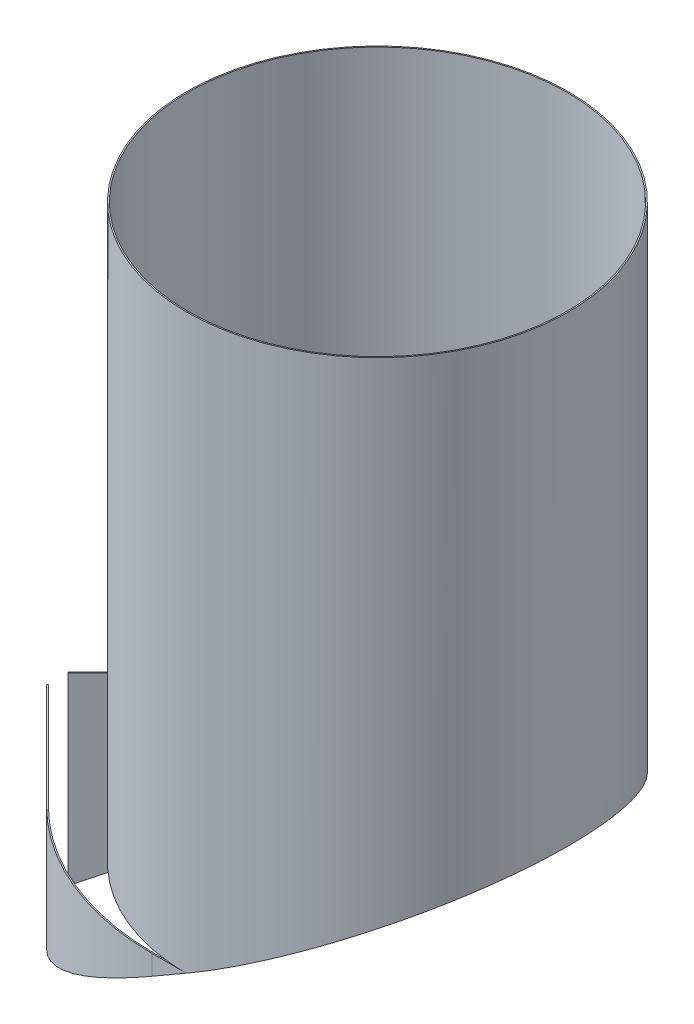
ISO-10303-21;
HEADER;
FILE_DESCRIPTION(('STEP AP214'),'2;1');
FILE_NAME('part.step','',(''),(''),'','','');
FILE_SCHEMA(('AUTOMOTIVE_DESIGN { 1 0 10303 214 1 1 1 1 }'));
ENDSEC;
DATA;
#1=APPLICATION_CONTEXT('core data for automotive mechanical design processes');
#2=APPLICATION_PROTOCOL_DEFINITION('international standard','automotive_design',2000,#1);
#3=PRODUCT_CONTEXT('',#1,'mechanical');
#4=PRODUCT('Part','Part','',(#3));
#5=PRODUCT_RELATED_PRODUCT_CATEGORY('part','',(#4));
#6=PRODUCT_DEFINITION_FORMATION('','',#4);
#7=PRODUCT_DEFINITION_CONTEXT('part definition',#1,'design');
#8=PRODUCT_DEFINITION('design','',#6,#7);
#9=PRODUCT_DEFINITION_SHAPE('','',#8);
#10=(LENGTH_UNIT() NAMED_UNIT(*) SI_UNIT(.MILLI.,.METRE.));
#11=(NAMED_UNIT(*) PLANE_ANGLE_UNIT() SI_UNIT($,.RADIAN.));
#12=(NAMED_UNIT(*) SI_UNIT($,.STERADIAN.) SOLID_ANGLE_UNIT());
#13=UNCERTAINTY_MEASURE_WITH_UNIT(LENGTH_MEASURE(1.E-05),#10,'distance_accuracy_value','');
#14=(GEOMETRIC_REPRESENTATION_CONTEXT(3) GLOBAL_UNCERTAINTY_ASSIGNED_CONTEXT((#13)) GLOBAL_UNIT_ASSIGNED_CONTEXT((#10,
#11,#12)) REPRESENTATION_CONTEXT('',''));
#15=CARTESIAN_POINT('',(0.,0.,0.));
#16=DIRECTION('',(0.,0.,1.));
#17=DIRECTION('',(1.,0.,0.));
#18=AXIS2_PLACEMENT_3D('',#15,#16,#17);
#19=CARTESIAN_POINT('',(0.,600.,0.));
#20=DIRECTION('',(0.,-1.,0.));
#21=DIRECTION('',(0.,0.,-1.));
#22=AXIS2_PLACEMENT_3D('',#19,#20,#21);
#23=CYLINDRICAL_SURFACE('',#22,12.);
#24=DIRECTION('',(0.,-1.,0.));
#25=VECTOR('',#24,1.);
#26=CARTESIAN_POINT('',(9.16287404383041,600.,-7.74866048145735));
#27=LINE('',#26,#25);
#28=CARTESIAN_POINT('',(9.16287404383041,150.,-7.74866048145735));
#29=VERTEX_POINT('',#28);
#30=CARTESIAN_POINT('',(9.16287404383041,5.29018779575605,-7.74866048145735));
#31=VERTEX_POINT('',#30);
#32=EDGE_CURVE('E163',#29,#31,#27,.T.);
#33=ORIENTED_EDGE('',*,*,#32,.F.);
#34=CARTESIAN_POINT('',(0.,150.,0.));
#35=DIRECTION('',(0.,1.,0.));
#36=DIRECTION('',(0.,0.,1.));
#37=AXIS2_PLACEMENT_3D('',#34,#35,#36);
#38=CIRCLE('',#37,12.);
#39=CARTESIAN_POINT('',(8.48528137423856,150.,-8.48528137423859));
#40=VERTEX_POINT('',#39);
#41=EDGE_CURVE('E195',#40,#29,#38,.F.);
#42=ORIENTED_EDGE('',*,*,#41,.F.);
#43=DIRECTION('',(0.,-1.,0.));
#44=VECTOR('',#43,1.);
#45=CARTESIAN_POINT('',(8.48528137423855,600.,-8.48528137423859));
#46=LINE('',#45,#44);
#47=CARTESIAN_POINT('',(8.48528137423856,4.89897948556643,-8.48528137423858));
#48=VERTEX_POINT('',#47);
#49=EDGE_CURVE('E185',#40,#48,#46,.T.);
#50=ORIENTED_EDGE('',*,*,#49,.T.);
#51=CARTESIAN_POINT('',(0.,0.,0.));
#52=DIRECTION('',(-0.499999999999995,0.866025403784442,0.));
#53=DIRECTION('',(-0.866025403784442,-0.499999999999995,0.));
#54=AXIS2_PLACEMENT_3D('',#51,#52,#53);
#55=ELLIPSE('',#54,13.856406460551,12.);
#56=EDGE_CURVE('E169',#48,#31,#55,.F.);
#57=ORIENTED_EDGE('',*,*,#56,.T.);
#58=EDGE_LOOP('',(#33,#42,#50,#57));
#59=FACE_BOUND('',#58,.T.);
#60=ADVANCED_FACE('F35',(#59),#23,.F.);
#61=CARTESIAN_POINT('',(260.,150.,0.));
#62=DIRECTION('',(0.,1.,0.));
#63=DIRECTION('',(0.,0.,1.));
#64=AXIS2_PLACEMENT_3D('',#61,#62,#63);
#65=PLANE('',#64);
#66=DIRECTION('',(0.707106781186546,0.,0.707106781186549));
#67=VECTOR('',#66,1.);
#68=CARTESIAN_POINT('',(9.1923881554251,150.,7.77817459305204));
#69=LINE('',#68,#67);
#70=CARTESIAN_POINT('',(9.16287404383041,150.,7.74866048145735));
#71=VERTEX_POINT('',#70);
#72=CARTESIAN_POINT('',(92.1284630184955,150.,90.7142494561227));
#73=VERTEX_POINT('',#72);
#74=EDGE_CURVE('E268',#71,#73,#69,.T.);
#75=ORIENTED_EDGE('',*,*,#74,.F.);
#76=CARTESIAN_POINT('',(8.48528137423856,150.,8.48528137423859));
#77=VERTEX_POINT('',#76);
#78=EDGE_CURVE('E161',#71,#77,#38,.F.);
#79=ORIENTED_EDGE('',*,*,#78,.T.);
#80=DIRECTION('',(0.707106781186546,0.,0.707106781186549));
#81=VECTOR('',#80,1.);
#82=CARTESIAN_POINT('',(0.,150.,0.));
#83=LINE('',#82,#81);
#84=CARTESIAN_POINT('',(91.4213562373089,150.,91.4213562373092));
#85=VERTEX_POINT('',#84);
#86=EDGE_CURVE('E223',#77,#85,#83,.T.);
#87=ORIENTED_EDGE('',*,*,#86,.T.);
#88=CARTESIAN_POINT('',(232.842712474619,150.,-50.));
#89=DIRECTION('',(0.,1.,0.));
#90=DIRECTION('',(0.,0.,1.));
#91=AXIS2_PLACEMENT_3D('',#88,#89,#90);
#92=CIRCLE('',#91,200.);
#93=CARTESIAN_POINT('',(232.842712474619,150.,150.));
#94=VERTEX_POINT('',#93);
#95=EDGE_CURVE('E241',#85,#94,#92,.T.);
#96=ORIENTED_EDGE('',*,*,#95,.T.);
#97=DIRECTION('',(1.,0.,0.));
#98=VECTOR('',#97,1.);
#99=CARTESIAN_POINT('',(149.999999999999,150.,150.));
#100=LINE('',#99,#98);
#101=CARTESIAN_POINT('',(259.807621135335,150.,149.999938317262));
#102=VERTEX_POINT('',#101);
#103=EDGE_CURVE('E219',#94,#102,#100,.T.);
#104=ORIENTED_EDGE('',*,*,#103,.T.);
#105=CARTESIAN_POINT('',(260.,150.,0.));
#106=DIRECTION('',(0.,-1.,0.));
#107=DIRECTION('',(0.,0.,1.));
#108=AXIS2_PLACEMENT_3D('',#105,#106,#107);
#109=CIRCLE('',#108,150.);
#110=CARTESIAN_POINT('',(242.708383534209,150.,149.));
#111=VERTEX_POINT('',#110);
#112=EDGE_CURVE('E199',#102,#111,#109,.T.);
#113=ORIENTED_EDGE('',*,*,#112,.T.);
#114=DIRECTION('',(1.,0.,0.));
#115=VECTOR('',#114,1.);
#116=CARTESIAN_POINT('',(149.999999999999,150.,149.));
#117=LINE('',#116,#115);
#118=CARTESIAN_POINT('',(232.842712474619,150.,149.));
#119=VERTEX_POINT('',#118);
#120=EDGE_CURVE('E285',#119,#111,#117,.T.);
#121=ORIENTED_EDGE('',*,*,#120,.F.);
#122=CARTESIAN_POINT('',(232.842712474619,150.,-50.));
#123=DIRECTION('',(0.,1.,0.));
#124=DIRECTION('',(0.,0.,1.));
#125=AXIS2_PLACEMENT_3D('',#122,#123,#124);
#126=CIRCLE('',#125,199.);
#127=EDGE_CURVE('E286',#73,#119,#126,.T.);
#128=ORIENTED_EDGE('',*,*,#127,.F.);
#129=EDGE_LOOP('',(#75,#79,#87,#96,#104,#113,#121,#128));
#130=FACE_BOUND('',#129,.T.);
#131=ADVANCED_FACE('F265',(#130),#65,.T.);
#132=ORIENTED_EDGE('',*,*,#78,.F.);
#133=DIRECTION('',(0.,-1.,0.));
#134=VECTOR('',#133,1.);
#135=CARTESIAN_POINT('',(9.16287404383041,600.,7.74866048145735));
#136=LINE('',#135,#134);
#137=CARTESIAN_POINT('',(9.16287404383041,5.29018779575605,7.74866048145735));
#138=VERTEX_POINT('',#137);
#139=EDGE_CURVE('E146',#71,#138,#136,.T.);
#140=ORIENTED_EDGE('',*,*,#139,.T.);
#141=CARTESIAN_POINT('',(8.48528137423855,4.89897948556628,8.48528137423859));
#142=VERTEX_POINT('',#141);
#143=EDGE_CURVE('E159',#138,#142,#55,.F.);
#144=ORIENTED_EDGE('',*,*,#143,.T.);
#145=DIRECTION('',(0.,-1.,0.));
#146=VECTOR('',#145,1.);
#147=CARTESIAN_POINT('',(8.48528137423855,600.,8.48528137423859));
#148=LINE('',#147,#146);
#149=EDGE_CURVE('E188',#77,#142,#148,.T.);
#150=ORIENTED_EDGE('',*,*,#149,.F.);
#151=EDGE_LOOP('',(#132,#140,#144,#150));
#152=FACE_BOUND('',#151,.T.);
#153=ADVANCED_FACE('F157',(#152),#23,.F.);
#154=CARTESIAN_POINT('',(8.48528137423855,600.,8.48528137423859));
#155=DIRECTION('',(0.707106781186549,0.,-0.707106781186546));
#156=DIRECTION('',(-0.707106781186546,0.,-0.707106781186549));
#157=AXIS2_PLACEMENT_3D('',#154,#155,#156);
#158=PLANE('',#157);
#159=DIRECTION('',(0.654653670707977,0.377964473009222,0.65465367070798));
#160=VECTOR('',#159,1.);
#161=CARTESIAN_POINT('',(155.734596112392,89.9134109876261,155.734596112393));
#162=LINE('',#161,#160);
#163=CARTESIAN_POINT('',(91.4213562373089,52.7821446332903,91.4213562373092));
#164=VERTEX_POINT('',#163);
#165=EDGE_CURVE('E168',#142,#164,#162,.T.);
#166=ORIENTED_EDGE('',*,*,#165,.T.);
#167=DIRECTION('',(0.,-1.,0.));
#168=VECTOR('',#167,1.);
#169=CARTESIAN_POINT('',(91.4213562373089,600.,91.4213562373092));
#170=LINE('',#169,#168);
#171=EDGE_CURVE('E238',#164,#85,#170,.F.);
#172=ORIENTED_EDGE('',*,*,#171,.T.);
#173=ORIENTED_EDGE('',*,*,#86,.F.);
#174=ORIENTED_EDGE('',*,*,#149,.T.);
#175=EDGE_LOOP('',(#166,#172,#173,#174));
#176=FACE_BOUND('',#175,.T.);
#177=ADVANCED_FACE('F270',(#176),#158,.F.);
#178=CARTESIAN_POINT('',(149.999999999999,600.,150.));
#179=DIRECTION('',(0.,0.,-1.));
#180=DIRECTION('',(-1.,0.,0.));
#181=AXIS2_PLACEMENT_3D('',#178,#179,#180);
#182=PLANE('',#181);
#183=ORIENTED_EDGE('',*,*,#103,.F.);
#184=DIRECTION('',(0.,-1.,0.));
#185=VECTOR('',#184,1.);
#186=CARTESIAN_POINT('',(232.842712474619,600.,150.));
#187=LINE('',#186,#185);
#188=CARTESIAN_POINT('',(232.842712474619,134.431802726062,150.));
#189=VERTEX_POINT('',#188);
#190=EDGE_CURVE('E191',#94,#189,#187,.T.);
#191=ORIENTED_EDGE('',*,*,#190,.T.);
#192=DIRECTION('',(-0.866025403784442,-0.499999999999995,0.));
#193=VECTOR('',#192,1.);
#194=CARTESIAN_POINT('',(0.,0.,150.));
#195=LINE('',#194,#193);
#196=EDGE_CURVE('E174',#102,#189,#195,.T.);
#197=ORIENTED_EDGE('',*,*,#196,.F.);
#198=EDGE_LOOP('',(#183,#191,#197));
#199=FACE_BOUND('',#198,.T.);
#200=ADVANCED_FACE('F277',(#199),#182,.F.);
#201=CARTESIAN_POINT('',(149.999999999999,600.,-150.));
#202=DIRECTION('',(0.,0.,1.));
#203=DIRECTION('',(1.,0.,0.));
#204=AXIS2_PLACEMENT_3D('',#201,#202,#203);
#205=PLANE('',#204);
#206=DIRECTION('',(-0.866025403784442,-0.499999999999995,0.));
#207=VECTOR('',#206,1.);
#208=CARTESIAN_POINT('',(0.,0.,-150.));
#209=LINE('',#208,#207);
#210=CARTESIAN_POINT('',(259.807621135335,150.,-149.999938317262));
#211=VERTEX_POINT('',#210);
#212=CARTESIAN_POINT('',(232.842712474619,134.431802726062,-150.));
#213=VERTEX_POINT('',#212);
#214=EDGE_CURVE('E170',#211,#213,#209,.T.);
#215=ORIENTED_EDGE('',*,*,#214,.T.);
#216=DIRECTION('',(0.,-1.,0.));
#217=VECTOR('',#216,1.);
#218=CARTESIAN_POINT('',(232.842712474619,600.,-150.));
#219=LINE('',#218,#217);
#220=CARTESIAN_POINT('',(232.842712474619,150.,-150.));
#221=VERTEX_POINT('',#220);
#222=EDGE_CURVE('E43',#213,#221,#219,.F.);
#223=ORIENTED_EDGE('',*,*,#222,.T.);
#224=DIRECTION('',(-1.,0.,0.));
#225=VECTOR('',#224,1.);
#226=CARTESIAN_POINT('',(149.999999999999,150.,-150.));
#227=LINE('',#226,#225);
#228=EDGE_CURVE('E203',#211,#221,#227,.T.);
#229=ORIENTED_EDGE('',*,*,#228,.F.);
#230=EDGE_LOOP('',(#215,#223,#229));
#231=FACE_BOUND('',#230,.T.);
#232=ADVANCED_FACE('F250',(#231),#205,.F.);
#233=CARTESIAN_POINT('',(8.48528137423855,600.,-8.48528137423859));
#234=DIRECTION('',(0.707106781186549,0.,0.707106781186546));
#235=DIRECTION('',(0.707106781186546,0.,-0.707106781186549));
#236=AXIS2_PLACEMENT_3D('',#233,#234,#235);
#237=PLANE('',#236);
#238=DIRECTION('',(-0.707106781186546,0.,0.707106781186549));
#239=VECTOR('',#238,1.);
#240=CARTESIAN_POINT('',(0.,150.,0.));
#241=LINE('',#240,#239);
#242=CARTESIAN_POINT('',(91.4213562373089,150.,-91.4213562373092));
#243=VERTEX_POINT('',#242);
#244=EDGE_CURVE('E254',#243,#40,#241,.T.);
#245=ORIENTED_EDGE('',*,*,#244,.F.);
#246=DIRECTION('',(0.,-1.,0.));
#247=VECTOR('',#246,1.);
#248=CARTESIAN_POINT('',(91.4213562373089,600.,-91.4213562373092));
#249=LINE('',#248,#247);
#250=CARTESIAN_POINT('',(91.4213562373089,52.7821446332903,-91.4213562373092));
#251=VERTEX_POINT('',#250);
#252=EDGE_CURVE('E242',#243,#251,#249,.T.);
#253=ORIENTED_EDGE('',*,*,#252,.T.);
#254=DIRECTION('',(-0.654653670707977,-0.377964473009222,0.65465367070798));
#255=VECTOR('',#254,1.);
#256=CARTESIAN_POINT('',(155.734596112392,89.9134109876261,-155.734596112393));
#257=LINE('',#256,#255);
#258=EDGE_CURVE('E190',#251,#48,#257,.T.);
#259=ORIENTED_EDGE('',*,*,#258,.T.);
#260=ORIENTED_EDGE('',*,*,#49,.F.);
#261=EDGE_LOOP('',(#245,#253,#259,#260));
#262=FACE_BOUND('',#261,.T.);
#263=ADVANCED_FACE('F258',(#262),#237,.F.);
#264=CARTESIAN_POINT('',(260.,600.,0.));
#265=DIRECTION('',(0.,-1.,0.));
#266=DIRECTION('',(0.,0.,-1.));
#267=AXIS2_PLACEMENT_3D('',#264,#265,#266);
#268=CYLINDRICAL_SURFACE('',#267,150.);
#269=ORIENTED_EDGE('',*,*,#112,.F.);
#270=CARTESIAN_POINT('',(260.,150.111069989301,0.));
#271=DIRECTION('',(-0.499999999999995,0.866025403784442,0.));
#272=DIRECTION('',(-0.866025403784442,-0.499999999999995,0.));
#273=AXIS2_PLACEMENT_3D('',#270,#271,#272);
#274=ELLIPSE('',#273,173.205080756887,150.);
#275=EDGE_CURVE('E181',#102,#211,#274,.T.);
#276=ORIENTED_EDGE('',*,*,#275,.T.);
#277=CARTESIAN_POINT('',(242.708383534209,150.,-149.));
#278=VERTEX_POINT('',#277);
#279=EDGE_CURVE('E217',#278,#211,#109,.T.);
#280=ORIENTED_EDGE('',*,*,#279,.F.);
#281=EDGE_CURVE('E204',#111,#278,#109,.T.);
#282=ORIENTED_EDGE('',*,*,#281,.F.);
#283=EDGE_LOOP('',(#269,#276,#280,#282));
#284=FACE_BOUND('',#283,.T.);
#285=CARTESIAN_POINT('',(260.,600.,0.));
#286=DIRECTION('',(0.,1.,0.));
#287=DIRECTION('',(0.,0.,1.));
#288=AXIS2_PLACEMENT_3D('',#285,#286,#287);
#289=CIRCLE('',#288,150.);
#290=CARTESIAN_POINT('',(260.,600.,150.));
#291=VERTEX_POINT('',#290);
#292=EDGE_CURVE('E182',#291,#291,#289,.T.);
#293=ORIENTED_EDGE('',*,*,#292,.F.);
#294=EDGE_LOOP('',(#293));
#295=FACE_BOUND('',#294,.T.);
#296=ADVANCED_FACE('F281',(#284,#295),#268,.T.);
#297=CARTESIAN_POINT('',(0.,600.,0.));
#298=DIRECTION('',(0.,1.,0.));
#299=DIRECTION('',(0.,0.,1.));
#300=AXIS2_PLACEMENT_3D('',#297,#298,#299);
#301=PLANE('',#300);
#302=CARTESIAN_POINT('',(260.,600.,0.));
#303=DIRECTION('',(0.,1.,0.));
#304=DIRECTION('',(0.,0.,1.));
#305=AXIS2_PLACEMENT_3D('',#302,#303,#304);
#306=CIRCLE('',#305,149.);
#307=CARTESIAN_POINT('',(260.,600.,149.));
#308=VERTEX_POINT('',#307);
#309=EDGE_CURVE('E297',#308,#308,#306,.T.);
#310=ORIENTED_EDGE('',*,*,#309,.F.);
#311=EDGE_LOOP('',(#310));
#312=FACE_BOUND('',#311,.T.);
#313=ORIENTED_EDGE('',*,*,#292,.T.);
#314=EDGE_LOOP('',(#313));
#315=FACE_BOUND('',#314,.T.);
#316=ADVANCED_FACE('F381',(#312,#315),#301,.T.);
#317=CARTESIAN_POINT('',(0.,0.,-150.));
#318=DIRECTION('',(-0.499999999999995,0.866025403784442,0.));
#319=DIRECTION('',(-0.866025403784442,-0.499999999999995,0.));
#320=AXIS2_PLACEMENT_3D('',#317,#318,#319);
#321=PLANE('',#320);
#322=ORIENTED_EDGE('',*,*,#143,.F.);
#323=DIRECTION('',(0.654653670707977,0.377964473009222,0.65465367070798));
#324=VECTOR('',#323,1.);
#325=CARTESIAN_POINT('',(156.340687639123,90.263338093738,154.926474076751));
#326=LINE('',#325,#324);
#327=CARTESIAN_POINT('',(92.1284630184954,53.1903929237542,90.7142494561227));
#328=VERTEX_POINT('',#327);
#329=EDGE_CURVE('E142',#138,#328,#326,.T.);
#330=ORIENTED_EDGE('',*,*,#329,.T.);
#331=CARTESIAN_POINT('',(232.842712474619,134.431802726062,-50.));
#332=DIRECTION('',(-0.499999999999995,0.866025403784442,0.));
#333=DIRECTION('',(-0.866025403784442,-0.499999999999995,0.));
#334=AXIS2_PLACEMENT_3D('',#331,#332,#333);
#335=ELLIPSE('',#334,229.78540713747,199.);
#336=CARTESIAN_POINT('',(232.842712474619,134.431802726062,149.));
#337=VERTEX_POINT('',#336);
#338=EDGE_CURVE('E333',#337,#328,#335,.F.);
#339=ORIENTED_EDGE('',*,*,#338,.F.);
#340=DIRECTION('',(-0.866025403784442,-0.499999999999995,0.));
#341=VECTOR('',#340,1.);
#342=CARTESIAN_POINT('',(0.,0.,149.));
#343=LINE('',#342,#341);
#344=CARTESIAN_POINT('',(259.807621225532,150.000000052075,148.999906855003));
#345=VERTEX_POINT('',#344);
#346=EDGE_CURVE('E305',#345,#337,#343,.T.);
#347=ORIENTED_EDGE('',*,*,#346,.F.);
#348=CARTESIAN_POINT('',(260.,150.111069989301,0.));
#349=DIRECTION('',(-0.499999999999995,0.866025403784442,0.));
#350=DIRECTION('',(-0.866025403784442,-0.499999999999995,0.));
#351=AXIS2_PLACEMENT_3D('',#348,#349,#350);
#352=ELLIPSE('',#351,172.050380218508,149.);
#353=CARTESIAN_POINT('',(259.807621225532,150.000000052075,-148.999906855003));
#354=VERTEX_POINT('',#353);
#355=EDGE_CURVE('E152',#345,#354,#352,.T.);
#356=ORIENTED_EDGE('',*,*,#355,.T.);
#357=DIRECTION('',(-0.866025403784442,-0.499999999999995,0.));
#358=VECTOR('',#357,1.);
#359=CARTESIAN_POINT('',(372.30762113533,214.951905283829,-149.));
#360=LINE('',#359,#358);
#361=CARTESIAN_POINT('',(232.842712474619,134.431802726062,-149.));
#362=VERTEX_POINT('',#361);
#363=EDGE_CURVE('E153',#354,#362,#360,.T.);
#364=ORIENTED_EDGE('',*,*,#363,.T.);
#365=CARTESIAN_POINT('',(232.842712474619,134.431802726062,50.));
#366=DIRECTION('',(-0.499999999999995,0.866025403784442,0.));
#367=DIRECTION('',(-0.866025403784442,-0.499999999999995,0.));
#368=AXIS2_PLACEMENT_3D('',#365,#366,#367);
#369=ELLIPSE('',#368,229.78540713747,199.);
#370=CARTESIAN_POINT('',(92.1284630184955,53.1903929237542,-90.7142494561227));
#371=VERTEX_POINT('',#370);
#372=EDGE_CURVE('E332',#371,#362,#369,.F.);
#373=ORIENTED_EDGE('',*,*,#372,.F.);
#374=DIRECTION('',(-0.654653670707977,-0.377964473009222,0.65465367070798));
#375=VECTOR('',#374,1.);
#376=CARTESIAN_POINT('',(156.340687639123,90.263338093738,-154.926474076751));
#377=LINE('',#376,#375);
#378=EDGE_CURVE('E162',#371,#31,#377,.T.);
#379=ORIENTED_EDGE('',*,*,#378,.T.);
#380=ORIENTED_EDGE('',*,*,#56,.F.);
#381=ORIENTED_EDGE('',*,*,#258,.F.);
#382=CARTESIAN_POINT('',(232.842712474619,134.431802726062,50.));
#383=DIRECTION('',(-0.499999999999995,0.866025403784442,0.));
#384=DIRECTION('',(-0.866025403784442,-0.499999999999995,0.));
#385=AXIS2_PLACEMENT_3D('',#382,#383,#384);
#386=ELLIPSE('',#385,230.94010767585,200.);
#387=EDGE_CURVE('E234',#251,#213,#386,.F.);
#388=ORIENTED_EDGE('',*,*,#387,.T.);
#389=ORIENTED_EDGE('',*,*,#214,.F.);
#390=ORIENTED_EDGE('',*,*,#275,.F.);
#391=ORIENTED_EDGE('',*,*,#196,.T.);
#392=CARTESIAN_POINT('',(232.842712474619,134.431802726062,-50.));
#393=DIRECTION('',(-0.499999999999995,0.866025403784442,0.));
#394=DIRECTION('',(-0.866025403784442,-0.499999999999995,0.));
#395=AXIS2_PLACEMENT_3D('',#392,#393,#394);
#396=ELLIPSE('',#395,230.94010767585,200.);
#397=EDGE_CURVE('E236',#189,#164,#396,.F.);
#398=ORIENTED_EDGE('',*,*,#397,.T.);
#399=ORIENTED_EDGE('',*,*,#165,.F.);
#400=EDGE_LOOP('',(#322,#330,#339,#347,#356,#364,#373,#379,#380,#381,#388,#389,#390,#391,#398,#399));
#401=FACE_BOUND('',#400,.T.);
#402=ADVANCED_FACE('F166',(#401),#321,.F.);
#403=DIRECTION('',(-1.,0.,0.));
#404=VECTOR('',#403,1.);
#405=CARTESIAN_POINT('',(149.999999999999,150.,-149.));
#406=LINE('',#405,#404);
#407=CARTESIAN_POINT('',(232.842712474619,150.,-149.));
#408=VERTEX_POINT('',#407);
#409=EDGE_CURVE('E11',#278,#408,#406,.T.);
#410=ORIENTED_EDGE('',*,*,#409,.F.);
#411=ORIENTED_EDGE('',*,*,#279,.T.);
#412=ORIENTED_EDGE('',*,*,#228,.T.);
#413=CARTESIAN_POINT('',(232.842712474619,150.,50.));
#414=DIRECTION('',(0.,1.,0.));
#415=DIRECTION('',(0.,0.,1.));
#416=AXIS2_PLACEMENT_3D('',#413,#414,#415);
#417=CIRCLE('',#416,200.);
#418=EDGE_CURVE('E58',#221,#243,#417,.T.);
#419=ORIENTED_EDGE('',*,*,#418,.T.);
#420=ORIENTED_EDGE('',*,*,#244,.T.);
#421=ORIENTED_EDGE('',*,*,#41,.T.);
#422=DIRECTION('',(-0.707106781186546,0.,0.707106781186549));
#423=VECTOR('',#422,1.);
#424=CARTESIAN_POINT('',(9.1923881554251,150.,-7.77817459305204));
#425=LINE('',#424,#423);
#426=CARTESIAN_POINT('',(92.1284630184955,150.,-90.7142494561227));
#427=VERTEX_POINT('',#426);
#428=EDGE_CURVE('E308',#427,#29,#425,.T.);
#429=ORIENTED_EDGE('',*,*,#428,.F.);
#430=CARTESIAN_POINT('',(232.842712474619,150.,50.));
#431=DIRECTION('',(0.,1.,0.));
#432=DIRECTION('',(0.,0.,1.));
#433=AXIS2_PLACEMENT_3D('',#430,#431,#432);
#434=CIRCLE('',#433,199.);
#435=EDGE_CURVE('E327',#408,#427,#434,.T.);
#436=ORIENTED_EDGE('',*,*,#435,.F.);
#437=EDGE_LOOP('',(#410,#411,#412,#419,#420,#421,#429,#436));
#438=FACE_BOUND('',#437,.T.);
#439=ADVANCED_FACE('F253',(#438),#65,.T.);
#440=CARTESIAN_POINT('',(232.842712474619,600.,-50.));
#441=DIRECTION('',(0.,-1.,0.));
#442=DIRECTION('',(0.,0.,-1.));
#443=AXIS2_PLACEMENT_3D('',#440,#441,#442);
#444=CYLINDRICAL_SURFACE('',#443,200.);
#445=ORIENTED_EDGE('',*,*,#95,.F.);
#446=ORIENTED_EDGE('',*,*,#171,.F.);
#447=ORIENTED_EDGE('',*,*,#397,.F.);
#448=ORIENTED_EDGE('',*,*,#190,.F.);
#449=EDGE_LOOP('',(#445,#446,#447,#448));
#450=FACE_BOUND('',#449,.T.);
#451=ADVANCED_FACE('F273',(#450),#444,.T.);
#452=CARTESIAN_POINT('',(232.842712474619,600.,50.));
#453=DIRECTION('',(0.,-1.,0.));
#454=DIRECTION('',(0.,0.,-1.));
#455=AXIS2_PLACEMENT_3D('',#452,#453,#454);
#456=CYLINDRICAL_SURFACE('',#455,200.);
#457=ORIENTED_EDGE('',*,*,#418,.F.);
#458=ORIENTED_EDGE('',*,*,#222,.F.);
#459=ORIENTED_EDGE('',*,*,#387,.F.);
#460=ORIENTED_EDGE('',*,*,#252,.F.);
#461=EDGE_LOOP('',(#457,#458,#459,#460));
#462=FACE_BOUND('',#461,.T.);
#463=ADVANCED_FACE('F37',(#462),#456,.T.);
#464=CARTESIAN_POINT('',(9.1923881554251,600.,7.77817459305204));
#465=DIRECTION('',(0.707106781186549,0.,-0.707106781186546));
#466=DIRECTION('',(-0.707106781186546,0.,-0.707106781186549));
#467=AXIS2_PLACEMENT_3D('',#464,#465,#466);
#468=PLANE('',#467);
#469=ORIENTED_EDGE('',*,*,#329,.F.);
#470=ORIENTED_EDGE('',*,*,#139,.F.);
#471=ORIENTED_EDGE('',*,*,#74,.T.);
#472=DIRECTION('',(0.,1.,0.));
#473=VECTOR('',#472,1.);
#474=CARTESIAN_POINT('',(92.1284630184954,600.,90.7142494561227));
#475=LINE('',#474,#473);
#476=EDGE_CURVE('E148',#328,#73,#475,.T.);
#477=ORIENTED_EDGE('',*,*,#476,.F.);
#478=EDGE_LOOP('',(#469,#470,#471,#477));
#479=FACE_BOUND('',#478,.T.);
#480=ADVANCED_FACE('F144',(#479),#468,.T.);
#481=CARTESIAN_POINT('',(149.999999999999,600.,149.));
#482=DIRECTION('',(0.,0.,-1.));
#483=DIRECTION('',(-1.,0.,0.));
#484=AXIS2_PLACEMENT_3D('',#481,#482,#483);
#485=PLANE('',#484);
#486=ORIENTED_EDGE('',*,*,#120,.T.);
#487=EDGE_CURVE('E290',#111,#345,#117,.T.);
#488=ORIENTED_EDGE('',*,*,#487,.T.);
#489=ORIENTED_EDGE('',*,*,#346,.T.);
#490=DIRECTION('',(0.,1.,0.));
#491=VECTOR('',#490,1.);
#492=CARTESIAN_POINT('',(232.842712474619,600.,149.));
#493=LINE('',#492,#491);
#494=EDGE_CURVE('E331',#119,#337,#493,.F.);
#495=ORIENTED_EDGE('',*,*,#494,.F.);
#496=EDGE_LOOP('',(#486,#488,#489,#495));
#497=FACE_BOUND('',#496,.T.);
#498=ADVANCED_FACE('F342',(#497),#485,.T.);
#499=CARTESIAN_POINT('',(149.999999999999,600.,-149.));
#500=DIRECTION('',(0.,0.,1.));
#501=DIRECTION('',(1.,0.,0.));
#502=AXIS2_PLACEMENT_3D('',#499,#500,#501);
#503=PLANE('',#502);
#504=ORIENTED_EDGE('',*,*,#363,.F.);
#505=DIRECTION('',(-1.,0.,0.));
#506=VECTOR('',#505,1.);
#507=CARTESIAN_POINT('',(149.999999999999,150.,-149.));
#508=LINE('',#507,#506);
#509=EDGE_CURVE('E292',#354,#278,#508,.T.);
#510=ORIENTED_EDGE('',*,*,#509,.T.);
#511=ORIENTED_EDGE('',*,*,#409,.T.);
#512=DIRECTION('',(0.,1.,0.));
#513=VECTOR('',#512,1.);
#514=CARTESIAN_POINT('',(232.842712474619,600.,-149.));
#515=LINE('',#514,#513);
#516=EDGE_CURVE('E229',#362,#408,#515,.T.);
#517=ORIENTED_EDGE('',*,*,#516,.F.);
#518=EDGE_LOOP('',(#504,#510,#511,#517));
#519=FACE_BOUND('',#518,.T.);
#520=ADVANCED_FACE('F397',(#519),#503,.T.);
#521=CARTESIAN_POINT('',(9.1923881554251,600.,-7.77817459305204));
#522=DIRECTION('',(0.707106781186549,0.,0.707106781186546));
#523=DIRECTION('',(0.707106781186546,0.,-0.707106781186549));
#524=AXIS2_PLACEMENT_3D('',#521,#522,#523);
#525=PLANE('',#524);
#526=ORIENTED_EDGE('',*,*,#428,.T.);
#527=ORIENTED_EDGE('',*,*,#32,.T.);
#528=ORIENTED_EDGE('',*,*,#378,.F.);
#529=DIRECTION('',(0.,1.,0.));
#530=VECTOR('',#529,1.);
#531=CARTESIAN_POINT('',(92.1284630184955,600.,-90.7142494561227));
#532=LINE('',#531,#530);
#533=EDGE_CURVE('E50',#427,#371,#532,.F.);
#534=ORIENTED_EDGE('',*,*,#533,.F.);
#535=EDGE_LOOP('',(#526,#527,#528,#534));
#536=FACE_BOUND('',#535,.T.);
#537=ADVANCED_FACE('F360',(#536),#525,.T.);
#538=CARTESIAN_POINT('',(260.,600.,0.));
#539=DIRECTION('',(0.,-1.,0.));
#540=DIRECTION('',(0.,0.,-1.));
#541=AXIS2_PLACEMENT_3D('',#538,#539,#540);
#542=CYLINDRICAL_SURFACE('',#541,149.);
#543=CARTESIAN_POINT('',(260.,150.,0.));
#544=DIRECTION('',(0.,1.,0.));
#545=DIRECTION('',(0.,0.,1.));
#546=AXIS2_PLACEMENT_3D('',#543,#544,#545);
#547=CIRCLE('',#546,149.);
#548=EDGE_CURVE('E289',#345,#354,#547,.F.);
#549=ORIENTED_EDGE('',*,*,#548,.T.);
#550=ORIENTED_EDGE('',*,*,#355,.F.);
#551=EDGE_LOOP('',(#549,#550));
#552=FACE_BOUND('',#551,.T.);
#553=ORIENTED_EDGE('',*,*,#309,.T.);
#554=EDGE_LOOP('',(#553));
#555=FACE_BOUND('',#554,.T.);
#556=ADVANCED_FACE('F348',(#552,#555),#542,.F.);
#557=CARTESIAN_POINT('',(260.,150.,0.));
#558=DIRECTION('',(0.,1.,0.));
#559=DIRECTION('',(0.,0.,1.));
#560=AXIS2_PLACEMENT_3D('',#557,#558,#559);
#561=PLANE('',#560);
#562=ORIENTED_EDGE('',*,*,#281,.T.);
#563=ORIENTED_EDGE('',*,*,#509,.F.);
#564=ORIENTED_EDGE('',*,*,#548,.F.);
#565=ORIENTED_EDGE('',*,*,#487,.F.);
#566=EDGE_LOOP('',(#562,#563,#564,#565));
#567=FACE_BOUND('',#566,.T.);
#568=ADVANCED_FACE('F351',(#567),#561,.F.);
#569=CARTESIAN_POINT('',(232.842712474619,600.,-50.));
#570=DIRECTION('',(0.,-1.,0.));
#571=DIRECTION('',(0.,0.,-1.));
#572=AXIS2_PLACEMENT_3D('',#569,#570,#571);
#573=CYLINDRICAL_SURFACE('',#572,199.);
#574=ORIENTED_EDGE('',*,*,#127,.T.);
#575=ORIENTED_EDGE('',*,*,#494,.T.);
#576=ORIENTED_EDGE('',*,*,#338,.T.);
#577=ORIENTED_EDGE('',*,*,#476,.T.);
#578=EDGE_LOOP('',(#574,#575,#576,#577));
#579=FACE_BOUND('',#578,.T.);
#580=ADVANCED_FACE('F341',(#579),#573,.F.);
#581=CARTESIAN_POINT('',(232.842712474619,600.,50.));
#582=DIRECTION('',(0.,-1.,0.));
#583=DIRECTION('',(0.,0.,-1.));
#584=AXIS2_PLACEMENT_3D('',#581,#582,#583);
#585=CYLINDRICAL_SURFACE('',#584,199.);
#586=ORIENTED_EDGE('',*,*,#435,.T.);
#587=ORIENTED_EDGE('',*,*,#533,.T.);
#588=ORIENTED_EDGE('',*,*,#372,.T.);
#589=ORIENTED_EDGE('',*,*,#516,.T.);
#590=EDGE_LOOP('',(#586,#587,#588,#589));
#591=FACE_BOUND('',#590,.T.);
#592=ADVANCED_FACE('F358',(#591),#585,.F.);
#593=CLOSED_SHELL('',(#60,#131,#153,#177,#200,#232,#263,#296,#316,#402,#439,#451,#463,#480,#498,
#520,#537,#556,#568,#580,#592));
#594=MANIFOLD_SOLID_BREP('B2',#593);
#595=ADVANCED_BREP_SHAPE_REPRESENTATION('',(#18,#594),#14);
#596=SHAPE_DEFINITION_REPRESENTATION(#9,#595);
ENDSEC;
END-ISO-10303-21;
